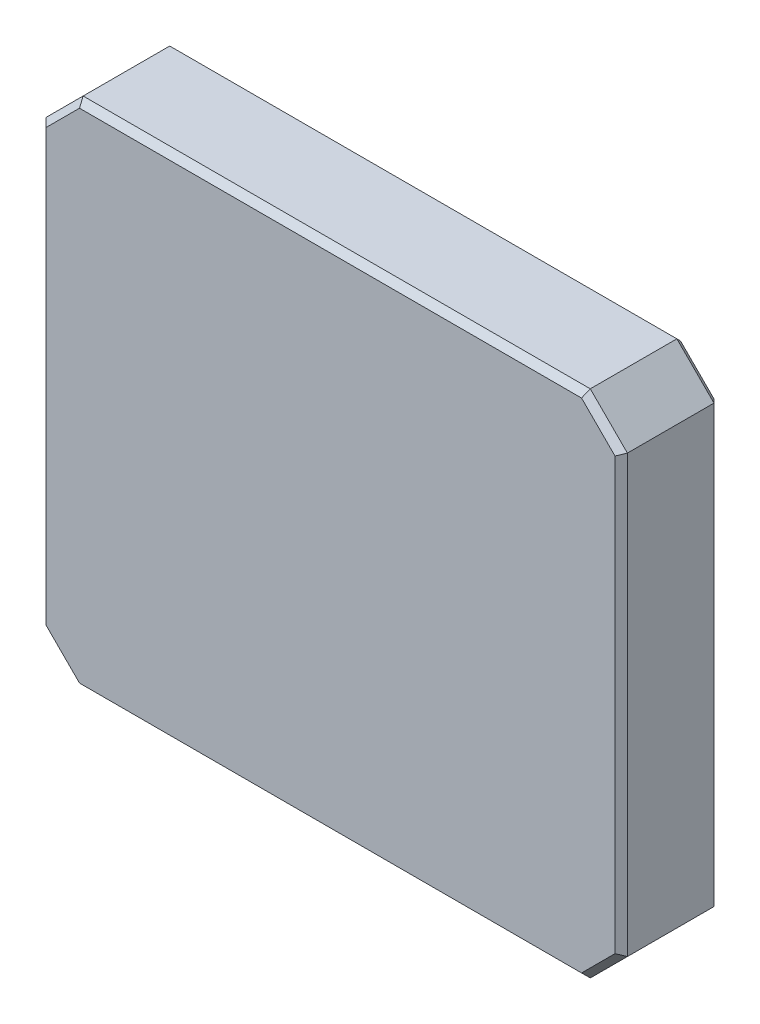
ISO-10303-21;
HEADER;
FILE_DESCRIPTION(('STEP AP214'),'2;1');
FILE_NAME('part.step','',(''),(''),'','','');
FILE_SCHEMA(('AUTOMOTIVE_DESIGN { 1 0 10303 214 1 1 1 1 }'));
ENDSEC;
DATA;
#1=APPLICATION_CONTEXT('core data for automotive mechanical design processes');
#2=APPLICATION_PROTOCOL_DEFINITION('international standard','automotive_design',2000,#1);
#3=PRODUCT_CONTEXT('',#1,'mechanical');
#4=PRODUCT('Part','Part','',(#3));
#5=PRODUCT_RELATED_PRODUCT_CATEGORY('part','',(#4));
#6=PRODUCT_DEFINITION_FORMATION('','',#4);
#7=PRODUCT_DEFINITION_CONTEXT('part definition',#1,'design');
#8=PRODUCT_DEFINITION('design','',#6,#7);
#9=PRODUCT_DEFINITION_SHAPE('','',#8);
#10=(LENGTH_UNIT() NAMED_UNIT(*) SI_UNIT(.MILLI.,.METRE.));
#11=(NAMED_UNIT(*) PLANE_ANGLE_UNIT() SI_UNIT($,.RADIAN.));
#12=(NAMED_UNIT(*) SI_UNIT($,.STERADIAN.) SOLID_ANGLE_UNIT());
#13=UNCERTAINTY_MEASURE_WITH_UNIT(LENGTH_MEASURE(1.E-05),#10,'distance_accuracy_value','');
#14=(GEOMETRIC_REPRESENTATION_CONTEXT(3) GLOBAL_UNCERTAINTY_ASSIGNED_CONTEXT((#13)) GLOBAL_UNIT_ASSIGNED_CONTEXT((#10,
#11,#12)) REPRESENTATION_CONTEXT('',''));
#15=CARTESIAN_POINT('',(0.,0.,0.));
#16=DIRECTION('',(0.,0.,1.));
#17=DIRECTION('',(1.,0.,0.));
#18=AXIS2_PLACEMENT_3D('',#15,#16,#17);
#19=CARTESIAN_POINT('',(-47.,-35.25,16.));
#20=DIRECTION('',(1.,0.,0.));
#21=DIRECTION('',(0.,0.,-1.));
#22=AXIS2_PLACEMENT_3D('',#19,#20,#21);
#23=PLANE('',#22);
#24=DIRECTION('',(0.,0.,-1.));
#25=VECTOR('',#24,1.);
#26=CARTESIAN_POINT('',(-47.,-35.25,16.));
#27=LINE('',#26,#25);
#28=CARTESIAN_POINT('',(-47.,-35.25,15.));
#29=VERTEX_POINT('',#28);
#30=CARTESIAN_POINT('',(-47.,-35.25,1.));
#31=VERTEX_POINT('',#30);
#32=EDGE_CURVE('E175',#29,#31,#27,.T.);
#33=ORIENTED_EDGE('',*,*,#32,.F.);
#34=DIRECTION('',(0.,1.,0.));
#35=VECTOR('',#34,1.);
#36=CARTESIAN_POINT('',(-47.,-35.25,15.));
#37=LINE('',#36,#35);
#38=CARTESIAN_POINT('',(-47.,35.25,15.));
#39=VERTEX_POINT('',#38);
#40=EDGE_CURVE('E216',#29,#39,#37,.T.);
#41=ORIENTED_EDGE('',*,*,#40,.T.);
#42=DIRECTION('',(0.,0.,-1.));
#43=VECTOR('',#42,1.);
#44=CARTESIAN_POINT('',(-47.,35.25,16.));
#45=LINE('',#44,#43);
#46=CARTESIAN_POINT('',(-47.,35.25,1.));
#47=VERTEX_POINT('',#46);
#48=EDGE_CURVE('E248',#39,#47,#45,.T.);
#49=ORIENTED_EDGE('',*,*,#48,.T.);
#50=DIRECTION('',(0.,-1.,0.));
#51=VECTOR('',#50,1.);
#52=CARTESIAN_POINT('',(-47.,-35.25,1.));
#53=LINE('',#52,#51);
#54=EDGE_CURVE('E214',#47,#31,#53,.T.);
#55=ORIENTED_EDGE('',*,*,#54,.T.);
#56=EDGE_LOOP('',(#33,#41,#49,#55));
#57=FACE_BOUND('',#56,.T.);
#58=ADVANCED_FACE('F39',(#57),#23,.F.);
#59=CARTESIAN_POINT('',(-47.,-35.25,16.));
#60=DIRECTION('',(0.707106781186547,0.707106781186547,0.));
#61=DIRECTION('',(-0.707106781186548,0.707106781186548,0.));
#62=AXIS2_PLACEMENT_3D('',#59,#60,#61);
#63=PLANE('',#62);
#64=DIRECTION('',(0.,0.,-1.));
#65=VECTOR('',#64,1.);
#66=CARTESIAN_POINT('',(-41.,-41.25,16.));
#67=LINE('',#66,#65);
#68=CARTESIAN_POINT('',(-41.,-41.25,15.));
#69=VERTEX_POINT('',#68);
#70=CARTESIAN_POINT('',(-41.,-41.25,1.));
#71=VERTEX_POINT('',#70);
#72=EDGE_CURVE('E313',#69,#71,#67,.T.);
#73=ORIENTED_EDGE('',*,*,#72,.F.);
#74=DIRECTION('',(-0.707106781186548,0.707106781186548,0.));
#75=VECTOR('',#74,1.);
#76=CARTESIAN_POINT('',(-47.,-35.25,15.));
#77=LINE('',#76,#75);
#78=EDGE_CURVE('E212',#69,#29,#77,.T.);
#79=ORIENTED_EDGE('',*,*,#78,.T.);
#80=ORIENTED_EDGE('',*,*,#32,.T.);
#81=DIRECTION('',(0.707106781186548,-0.707106781186548,0.));
#82=VECTOR('',#81,1.);
#83=CARTESIAN_POINT('',(-41.,-41.25,1.));
#84=LINE('',#83,#82);
#85=EDGE_CURVE('E210',#31,#71,#84,.T.);
#86=ORIENTED_EDGE('',*,*,#85,.T.);
#87=EDGE_LOOP('',(#73,#79,#80,#86));
#88=FACE_BOUND('',#87,.T.);
#89=ADVANCED_FACE('F371',(#88),#63,.F.);
#90=CARTESIAN_POINT('',(-41.,-41.25,16.));
#91=DIRECTION('',(0.,1.,0.));
#92=DIRECTION('',(0.,0.,1.));
#93=AXIS2_PLACEMENT_3D('',#90,#91,#92);
#94=PLANE('',#93);
#95=DIRECTION('',(0.,0.,-1.));
#96=VECTOR('',#95,1.);
#97=CARTESIAN_POINT('',(41.,-41.25,16.));
#98=LINE('',#97,#96);
#99=CARTESIAN_POINT('',(41.,-41.25,15.));
#100=VERTEX_POINT('',#99);
#101=CARTESIAN_POINT('',(41.,-41.25,1.));
#102=VERTEX_POINT('',#101);
#103=EDGE_CURVE('E310',#100,#102,#98,.T.);
#104=ORIENTED_EDGE('',*,*,#103,.F.);
#105=DIRECTION('',(-1.,0.,0.));
#106=VECTOR('',#105,1.);
#107=CARTESIAN_POINT('',(-41.,-41.25,15.));
#108=LINE('',#107,#106);
#109=EDGE_CURVE('E208',#100,#69,#108,.T.);
#110=ORIENTED_EDGE('',*,*,#109,.T.);
#111=ORIENTED_EDGE('',*,*,#72,.T.);
#112=DIRECTION('',(1.,0.,0.));
#113=VECTOR('',#112,1.);
#114=CARTESIAN_POINT('',(41.,-41.25,1.));
#115=LINE('',#114,#113);
#116=EDGE_CURVE('E206',#71,#102,#115,.T.);
#117=ORIENTED_EDGE('',*,*,#116,.T.);
#118=EDGE_LOOP('',(#104,#110,#111,#117));
#119=FACE_BOUND('',#118,.T.);
#120=ADVANCED_FACE('F354',(#119),#94,.F.);
#121=CARTESIAN_POINT('',(41.,-41.25,16.));
#122=DIRECTION('',(-0.707106781186547,0.707106781186547,0.));
#123=DIRECTION('',(-0.707106781186548,-0.707106781186548,0.));
#124=AXIS2_PLACEMENT_3D('',#121,#122,#123);
#125=PLANE('',#124);
#126=DIRECTION('',(0.,0.,-1.));
#127=VECTOR('',#126,1.);
#128=CARTESIAN_POINT('',(47.,-35.25,16.));
#129=LINE('',#128,#127);
#130=CARTESIAN_POINT('',(47.,-35.25,15.));
#131=VERTEX_POINT('',#130);
#132=CARTESIAN_POINT('',(47.,-35.25,1.));
#133=VERTEX_POINT('',#132);
#134=EDGE_CURVE('E307',#131,#133,#129,.T.);
#135=ORIENTED_EDGE('',*,*,#134,.F.);
#136=DIRECTION('',(-0.707106781186548,-0.707106781186548,0.));
#137=VECTOR('',#136,1.);
#138=CARTESIAN_POINT('',(41.,-41.25,15.));
#139=LINE('',#138,#137);
#140=EDGE_CURVE('E204',#131,#100,#139,.T.);
#141=ORIENTED_EDGE('',*,*,#140,.T.);
#142=ORIENTED_EDGE('',*,*,#103,.T.);
#143=DIRECTION('',(0.707106781186548,0.707106781186548,0.));
#144=VECTOR('',#143,1.);
#145=CARTESIAN_POINT('',(47.,-35.25,1.));
#146=LINE('',#145,#144);
#147=EDGE_CURVE('E202',#102,#133,#146,.T.);
#148=ORIENTED_EDGE('',*,*,#147,.T.);
#149=EDGE_LOOP('',(#135,#141,#142,#148));
#150=FACE_BOUND('',#149,.T.);
#151=ADVANCED_FACE('F352',(#150),#125,.F.);
#152=CARTESIAN_POINT('',(47.,-35.25,16.));
#153=DIRECTION('',(-1.,0.,0.));
#154=DIRECTION('',(0.,-1.,0.));
#155=AXIS2_PLACEMENT_3D('',#152,#153,#154);
#156=PLANE('',#155);
#157=DIRECTION('',(0.,0.,-1.));
#158=VECTOR('',#157,1.);
#159=CARTESIAN_POINT('',(47.,35.25,16.));
#160=LINE('',#159,#158);
#161=CARTESIAN_POINT('',(47.,35.25,15.));
#162=VERTEX_POINT('',#161);
#163=CARTESIAN_POINT('',(47.,35.25,1.));
#164=VERTEX_POINT('',#163);
#165=EDGE_CURVE('E301',#162,#164,#160,.T.);
#166=ORIENTED_EDGE('',*,*,#165,.F.);
#167=DIRECTION('',(0.,-1.,0.));
#168=VECTOR('',#167,1.);
#169=CARTESIAN_POINT('',(47.,-35.25,15.));
#170=LINE('',#169,#168);
#171=EDGE_CURVE('E200',#162,#131,#170,.T.);
#172=ORIENTED_EDGE('',*,*,#171,.T.);
#173=ORIENTED_EDGE('',*,*,#134,.T.);
#174=DIRECTION('',(0.,1.,0.));
#175=VECTOR('',#174,1.);
#176=CARTESIAN_POINT('',(47.,35.25,1.));
#177=LINE('',#176,#175);
#178=EDGE_CURVE('E198',#133,#164,#177,.T.);
#179=ORIENTED_EDGE('',*,*,#178,.T.);
#180=EDGE_LOOP('',(#166,#172,#173,#179));
#181=FACE_BOUND('',#180,.T.);
#182=ADVANCED_FACE('F339',(#181),#156,.F.);
#183=CARTESIAN_POINT('',(41.,41.25,16.));
#184=DIRECTION('',(-0.707106781186547,-0.707106781186547,0.));
#185=DIRECTION('',(0.707106781186548,-0.707106781186548,0.));
#186=AXIS2_PLACEMENT_3D('',#183,#184,#185);
#187=PLANE('',#186);
#188=DIRECTION('',(0.,0.,-1.));
#189=VECTOR('',#188,1.);
#190=CARTESIAN_POINT('',(41.,41.25,16.));
#191=LINE('',#190,#189);
#192=CARTESIAN_POINT('',(41.,41.25,15.));
#193=VERTEX_POINT('',#192);
#194=CARTESIAN_POINT('',(41.,41.25,1.));
#195=VERTEX_POINT('',#194);
#196=EDGE_CURVE('E295',#193,#195,#191,.T.);
#197=ORIENTED_EDGE('',*,*,#196,.F.);
#198=DIRECTION('',(0.707106781186548,-0.707106781186548,0.));
#199=VECTOR('',#198,1.);
#200=CARTESIAN_POINT('',(41.,41.25,15.));
#201=LINE('',#200,#199);
#202=EDGE_CURVE('E196',#193,#162,#201,.T.);
#203=ORIENTED_EDGE('',*,*,#202,.T.);
#204=ORIENTED_EDGE('',*,*,#165,.T.);
#205=DIRECTION('',(-0.707106781186548,0.707106781186548,0.));
#206=VECTOR('',#205,1.);
#207=CARTESIAN_POINT('',(41.,41.25,1.));
#208=LINE('',#207,#206);
#209=EDGE_CURVE('E194',#164,#195,#208,.T.);
#210=ORIENTED_EDGE('',*,*,#209,.T.);
#211=EDGE_LOOP('',(#197,#203,#204,#210));
#212=FACE_BOUND('',#211,.T.);
#213=ADVANCED_FACE('F335',(#212),#187,.F.);
#214=CARTESIAN_POINT('',(-41.,41.25,16.));
#215=DIRECTION('',(0.,-1.,0.));
#216=DIRECTION('',(0.,0.,-1.));
#217=AXIS2_PLACEMENT_3D('',#214,#215,#216);
#218=PLANE('',#217);
#219=DIRECTION('',(0.,0.,-1.));
#220=VECTOR('',#219,1.);
#221=CARTESIAN_POINT('',(-41.,41.25,16.));
#222=LINE('',#221,#220);
#223=CARTESIAN_POINT('',(-41.,41.25,15.));
#224=VERTEX_POINT('',#223);
#225=CARTESIAN_POINT('',(-41.,41.25,1.));
#226=VERTEX_POINT('',#225);
#227=EDGE_CURVE('E293',#224,#226,#222,.T.);
#228=ORIENTED_EDGE('',*,*,#227,.F.);
#229=DIRECTION('',(1.,0.,0.));
#230=VECTOR('',#229,1.);
#231=CARTESIAN_POINT('',(-41.,41.25,15.));
#232=LINE('',#231,#230);
#233=EDGE_CURVE('E192',#224,#193,#232,.T.);
#234=ORIENTED_EDGE('',*,*,#233,.T.);
#235=ORIENTED_EDGE('',*,*,#196,.T.);
#236=DIRECTION('',(-1.,0.,0.));
#237=VECTOR('',#236,1.);
#238=CARTESIAN_POINT('',(-41.,41.25,1.));
#239=LINE('',#238,#237);
#240=EDGE_CURVE('E190',#195,#226,#239,.T.);
#241=ORIENTED_EDGE('',*,*,#240,.T.);
#242=EDGE_LOOP('',(#228,#234,#235,#241));
#243=FACE_BOUND('',#242,.T.);
#244=ADVANCED_FACE('F292',(#243),#218,.F.);
#245=CARTESIAN_POINT('',(-47.,35.25,16.));
#246=DIRECTION('',(0.707106781186547,-0.707106781186547,0.));
#247=DIRECTION('',(0.707106781186548,0.707106781186548,0.));
#248=AXIS2_PLACEMENT_3D('',#245,#246,#247);
#249=PLANE('',#248);
#250=ORIENTED_EDGE('',*,*,#48,.F.);
#251=DIRECTION('',(0.707106781186548,0.707106781186548,0.));
#252=VECTOR('',#251,1.);
#253=CARTESIAN_POINT('',(-47.,35.25,15.));
#254=LINE('',#253,#252);
#255=EDGE_CURVE('E162',#39,#224,#254,.T.);
#256=ORIENTED_EDGE('',*,*,#255,.T.);
#257=ORIENTED_EDGE('',*,*,#227,.T.);
#258=DIRECTION('',(-0.707106781186548,-0.707106781186548,0.));
#259=VECTOR('',#258,1.);
#260=CARTESIAN_POINT('',(-47.,35.25,1.));
#261=LINE('',#260,#259);
#262=EDGE_CURVE('E181',#226,#47,#261,.T.);
#263=ORIENTED_EDGE('',*,*,#262,.T.);
#264=EDGE_LOOP('',(#250,#256,#257,#263));
#265=FACE_BOUND('',#264,.T.);
#266=ADVANCED_FACE('F298',(#265),#249,.F.);
#267=CARTESIAN_POINT('',(0.,0.,16.));
#268=DIRECTION('',(0.,0.,-1.));
#269=DIRECTION('',(-1.,0.,0.));
#270=AXIS2_PLACEMENT_3D('',#267,#268,#269);
#271=PLANE('',#270);
#272=DIRECTION('',(-1.,0.,0.));
#273=VECTOR('',#272,1.);
#274=CARTESIAN_POINT('',(0.,40.25,16.));
#275=LINE('',#274,#273);
#276=CARTESIAN_POINT('',(40.5857864376269,40.25,16.));
#277=VERTEX_POINT('',#276);
#278=CARTESIAN_POINT('',(-40.5857864376269,40.25,16.));
#279=VERTEX_POINT('',#278);
#280=EDGE_CURVE('E179',#277,#279,#275,.T.);
#281=ORIENTED_EDGE('',*,*,#280,.T.);
#282=DIRECTION('',(-0.707106781186548,-0.707106781186548,0.));
#283=VECTOR('',#282,1.);
#284=CARTESIAN_POINT('',(-40.4178932188134,40.4178932188134,16.));
#285=LINE('',#284,#283);
#286=CARTESIAN_POINT('',(-46.,34.8357864376269,16.));
#287=VERTEX_POINT('',#286);
#288=EDGE_CURVE('E160',#279,#287,#285,.T.);
#289=ORIENTED_EDGE('',*,*,#288,.T.);
#290=DIRECTION('',(0.,-1.,0.));
#291=VECTOR('',#290,1.);
#292=CARTESIAN_POINT('',(-46.,0.,16.));
#293=LINE('',#292,#291);
#294=CARTESIAN_POINT('',(-46.,-34.8357864376269,16.));
#295=VERTEX_POINT('',#294);
#296=EDGE_CURVE('E168',#287,#295,#293,.T.);
#297=ORIENTED_EDGE('',*,*,#296,.T.);
#298=DIRECTION('',(0.707106781186548,-0.707106781186548,0.));
#299=VECTOR('',#298,1.);
#300=CARTESIAN_POINT('',(-40.4178932188134,-40.4178932188134,16.));
#301=LINE('',#300,#299);
#302=CARTESIAN_POINT('',(-40.5857864376269,-40.25,16.));
#303=VERTEX_POINT('',#302);
#304=EDGE_CURVE('E174',#295,#303,#301,.T.);
#305=ORIENTED_EDGE('',*,*,#304,.T.);
#306=DIRECTION('',(1.,0.,0.));
#307=VECTOR('',#306,1.);
#308=CARTESIAN_POINT('',(0.,-40.25,16.));
#309=LINE('',#308,#307);
#310=CARTESIAN_POINT('',(40.5857864376269,-40.25,16.));
#311=VERTEX_POINT('',#310);
#312=EDGE_CURVE('E319',#303,#311,#309,.T.);
#313=ORIENTED_EDGE('',*,*,#312,.T.);
#314=DIRECTION('',(0.707106781186548,0.707106781186548,0.));
#315=VECTOR('',#314,1.);
#316=CARTESIAN_POINT('',(40.4178932188134,-40.4178932188134,16.));
#317=LINE('',#316,#315);
#318=CARTESIAN_POINT('',(46.,-34.8357864376269,16.));
#319=VERTEX_POINT('',#318);
#320=EDGE_CURVE('E321',#311,#319,#317,.T.);
#321=ORIENTED_EDGE('',*,*,#320,.T.);
#322=DIRECTION('',(0.,1.,0.));
#323=VECTOR('',#322,1.);
#324=CARTESIAN_POINT('',(46.,0.,16.));
#325=LINE('',#324,#323);
#326=CARTESIAN_POINT('',(46.,34.8357864376269,16.));
#327=VERTEX_POINT('',#326);
#328=EDGE_CURVE('E323',#319,#327,#325,.T.);
#329=ORIENTED_EDGE('',*,*,#328,.T.);
#330=DIRECTION('',(-0.707106781186548,0.707106781186548,0.));
#331=VECTOR('',#330,1.);
#332=CARTESIAN_POINT('',(40.4178932188134,40.4178932188134,16.));
#333=LINE('',#332,#331);
#334=EDGE_CURVE('E185',#327,#277,#333,.T.);
#335=ORIENTED_EDGE('',*,*,#334,.T.);
#336=EDGE_LOOP('',(#281,#289,#297,#305,#313,#321,#329,#335));
#337=FACE_BOUND('',#336,.T.);
#338=ADVANCED_FACE('F177',(#337),#271,.F.);
#339=CARTESIAN_POINT('',(0.,0.,0.));
#340=DIRECTION('',(0.,0.,-1.));
#341=DIRECTION('',(-1.,0.,0.));
#342=AXIS2_PLACEMENT_3D('',#339,#340,#341);
#343=PLANE('',#342);
#344=DIRECTION('',(0.,1.,0.));
#345=VECTOR('',#344,1.);
#346=CARTESIAN_POINT('',(-46.,35.25,0.));
#347=LINE('',#346,#345);
#348=CARTESIAN_POINT('',(-46.,-34.8357864376269,0.));
#349=VERTEX_POINT('',#348);
#350=CARTESIAN_POINT('',(-46.,34.8357864376269,0.));
#351=VERTEX_POINT('',#350);
#352=EDGE_CURVE('E218',#349,#351,#347,.T.);
#353=ORIENTED_EDGE('',*,*,#352,.T.);
#354=DIRECTION('',(0.707106781186548,0.707106781186548,0.));
#355=VECTOR('',#354,1.);
#356=CARTESIAN_POINT('',(-40.2928932188135,40.5428932188135,0.));
#357=LINE('',#356,#355);
#358=CARTESIAN_POINT('',(-40.5857864376269,40.25,0.));
#359=VERTEX_POINT('',#358);
#360=EDGE_CURVE('E11',#351,#359,#357,.T.);
#361=ORIENTED_EDGE('',*,*,#360,.T.);
#362=DIRECTION('',(1.,0.,0.));
#363=VECTOR('',#362,1.);
#364=CARTESIAN_POINT('',(41.,40.25,0.));
#365=LINE('',#364,#363);
#366=CARTESIAN_POINT('',(40.5857864376269,40.25,0.));
#367=VERTEX_POINT('',#366);
#368=EDGE_CURVE('E49',#359,#367,#365,.T.);
#369=ORIENTED_EDGE('',*,*,#368,.T.);
#370=DIRECTION('',(0.707106781186548,-0.707106781186548,0.));
#371=VECTOR('',#370,1.);
#372=CARTESIAN_POINT('',(46.2928932188134,34.5428932188135,0.));
#373=LINE('',#372,#371);
#374=CARTESIAN_POINT('',(46.,34.8357864376269,0.));
#375=VERTEX_POINT('',#374);
#376=EDGE_CURVE('E228',#367,#375,#373,.T.);
#377=ORIENTED_EDGE('',*,*,#376,.T.);
#378=DIRECTION('',(0.,-1.,0.));
#379=VECTOR('',#378,1.);
#380=CARTESIAN_POINT('',(46.,-35.25,0.));
#381=LINE('',#380,#379);
#382=CARTESIAN_POINT('',(46.,-34.8357864376269,0.));
#383=VERTEX_POINT('',#382);
#384=EDGE_CURVE('E226',#375,#383,#381,.T.);
#385=ORIENTED_EDGE('',*,*,#384,.T.);
#386=DIRECTION('',(-0.707106781186548,-0.707106781186548,0.));
#387=VECTOR('',#386,1.);
#388=CARTESIAN_POINT('',(40.2928932188134,-40.5428932188134,0.));
#389=LINE('',#388,#387);
#390=CARTESIAN_POINT('',(40.5857864376269,-40.25,0.));
#391=VERTEX_POINT('',#390);
#392=EDGE_CURVE('E224',#383,#391,#389,.T.);
#393=ORIENTED_EDGE('',*,*,#392,.T.);
#394=DIRECTION('',(-1.,0.,0.));
#395=VECTOR('',#394,1.);
#396=CARTESIAN_POINT('',(-41.,-40.25,0.));
#397=LINE('',#396,#395);
#398=CARTESIAN_POINT('',(-40.5857864376269,-40.25,0.));
#399=VERTEX_POINT('',#398);
#400=EDGE_CURVE('E222',#391,#399,#397,.T.);
#401=ORIENTED_EDGE('',*,*,#400,.T.);
#402=DIRECTION('',(-0.707106781186548,0.707106781186548,0.));
#403=VECTOR('',#402,1.);
#404=CARTESIAN_POINT('',(-46.2928932188135,-34.5428932188135,0.));
#405=LINE('',#404,#403);
#406=EDGE_CURVE('E220',#399,#349,#405,.T.);
#407=ORIENTED_EDGE('',*,*,#406,.T.);
#408=EDGE_LOOP('',(#353,#361,#369,#377,#385,#393,#401,#407));
#409=FACE_BOUND('',#408,.T.);
#410=ADVANCED_FACE('F279',(#409),#343,.T.);
#411=CARTESIAN_POINT('',(40.4178932188134,-40.4178932188134,16.));
#412=DIRECTION('',(-0.5,0.5,-0.707106781186548));
#413=DIRECTION('',(0.707106781186548,0.707106781186548,0.));
#414=AXIS2_PLACEMENT_3D('',#411,#412,#413);
#415=PLANE('',#414);
#416=DIRECTION('',(-0.281084637714821,0.678598344545847,0.678598344545847));
#417=VECTOR('',#416,1.);
#418=CARTESIAN_POINT('',(37.3791613444087,-32.5085222105068,23.7414777894931));
#419=LINE('',#418,#417);
#420=EDGE_CURVE('E242',#100,#311,#419,.T.);
#421=ORIENTED_EDGE('',*,*,#420,.F.);
#422=ORIENTED_EDGE('',*,*,#140,.F.);
#423=DIRECTION('',(-0.678598344545848,0.281084637714819,0.678598344545846));
#424=VECTOR('',#423,1.);
#425=CARTESIAN_POINT('',(44.4942147311441,-34.2120697572452,17.5057852688559));
#426=LINE('',#425,#424);
#427=EDGE_CURVE('E245',#319,#131,#426,.F.);
#428=ORIENTED_EDGE('',*,*,#427,.F.);
#429=ORIENTED_EDGE('',*,*,#320,.F.);
#430=EDGE_LOOP('',(#421,#422,#428,#429));
#431=FACE_BOUND('',#430,.T.);
#432=ADVANCED_FACE('F348',(#431),#415,.F.);
#433=CARTESIAN_POINT('',(46.,0.,16.));
#434=DIRECTION('',(-0.707106781186546,0.,-0.707106781186549));
#435=DIRECTION('',(0.,1.,0.));
#436=AXIS2_PLACEMENT_3D('',#433,#434,#435);
#437=PLANE('',#436);
#438=ORIENTED_EDGE('',*,*,#427,.T.);
#439=ORIENTED_EDGE('',*,*,#171,.F.);
#440=DIRECTION('',(-0.678598344545849,-0.281084637714815,0.678598344545847));
#441=VECTOR('',#440,1.);
#442=CARTESIAN_POINT('',(39.3552977370326,32.0834606423747,22.6447022629673));
#443=LINE('',#442,#441);
#444=EDGE_CURVE('E239',#327,#162,#443,.F.);
#445=ORIENTED_EDGE('',*,*,#444,.F.);
#446=ORIENTED_EDGE('',*,*,#328,.F.);
#447=EDGE_LOOP('',(#438,#439,#445,#446));
#448=FACE_BOUND('',#447,.T.);
#449=ADVANCED_FACE('F342',(#448),#437,.F.);
#450=CARTESIAN_POINT('',(0.,-40.25,16.));
#451=DIRECTION('',(0.,0.707106781186547,-0.707106781186547));
#452=DIRECTION('',(1.,0.,0.));
#453=AXIS2_PLACEMENT_3D('',#450,#451,#452);
#454=PLANE('',#453);
#455=ORIENTED_EDGE('',*,*,#420,.T.);
#456=ORIENTED_EDGE('',*,*,#312,.F.);
#457=DIRECTION('',(0.281084637714821,0.678598344545847,0.678598344545847));
#458=VECTOR('',#457,1.);
#459=CARTESIAN_POINT('',(-40.604545985805,-40.2952895556355,15.9547104443645));
#460=LINE('',#459,#458);
#461=EDGE_CURVE('E236',#69,#303,#460,.T.);
#462=ORIENTED_EDGE('',*,*,#461,.F.);
#463=ORIENTED_EDGE('',*,*,#109,.F.);
#464=EDGE_LOOP('',(#455,#456,#462,#463));
#465=FACE_BOUND('',#464,.T.);
#466=ADVANCED_FACE('F378',(#465),#454,.F.);
#467=CARTESIAN_POINT('',(40.4178932188134,40.4178932188134,16.));
#468=DIRECTION('',(-0.500000000000001,-0.500000000000001,-0.707106781186546));
#469=DIRECTION('',(-0.707106781186548,0.707106781186548,0.));
#470=AXIS2_PLACEMENT_3D('',#467,#468,#469);
#471=PLANE('',#470);
#472=ORIENTED_EDGE('',*,*,#444,.T.);
#473=ORIENTED_EDGE('',*,*,#202,.F.);
#474=DIRECTION('',(-0.281084637714817,-0.678598344545848,0.678598344545848));
#475=VECTOR('',#474,1.);
#476=CARTESIAN_POINT('',(40.604545985805,40.2952895556355,15.9547104443645));
#477=LINE('',#476,#475);
#478=EDGE_CURVE('E233',#277,#193,#477,.F.);
#479=ORIENTED_EDGE('',*,*,#478,.F.);
#480=ORIENTED_EDGE('',*,*,#334,.F.);
#481=EDGE_LOOP('',(#472,#473,#479,#480));
#482=FACE_BOUND('',#481,.T.);
#483=ADVANCED_FACE('F330',(#482),#471,.F.);
#484=CARTESIAN_POINT('',(-40.4178932188134,-40.4178932188134,16.));
#485=DIRECTION('',(0.5,0.5,-0.707106781186548));
#486=DIRECTION('',(0.707106781186548,-0.707106781186548,0.));
#487=AXIS2_PLACEMENT_3D('',#484,#485,#486);
#488=PLANE('',#487);
#489=ORIENTED_EDGE('',*,*,#461,.T.);
#490=ORIENTED_EDGE('',*,*,#304,.F.);
#491=DIRECTION('',(0.678598344545847,0.281084637714821,0.678598344545847));
#492=VECTOR('',#491,1.);
#493=CARTESIAN_POINT('',(-39.3552977370325,-32.0834606423746,22.6447022629675));
#494=LINE('',#493,#492);
#495=EDGE_CURVE('E171',#29,#295,#494,.T.);
#496=ORIENTED_EDGE('',*,*,#495,.F.);
#497=ORIENTED_EDGE('',*,*,#78,.F.);
#498=EDGE_LOOP('',(#489,#490,#496,#497));
#499=FACE_BOUND('',#498,.T.);
#500=ADVANCED_FACE('F375',(#499),#488,.F.);
#501=CARTESIAN_POINT('',(0.,40.25,16.));
#502=DIRECTION('',(0.,-0.707106781186547,-0.707106781186547));
#503=DIRECTION('',(-1.,0.,0.));
#504=AXIS2_PLACEMENT_3D('',#501,#502,#503);
#505=PLANE('',#504);
#506=ORIENTED_EDGE('',*,*,#478,.T.);
#507=ORIENTED_EDGE('',*,*,#233,.F.);
#508=DIRECTION('',(0.281084637714822,-0.678598344545847,0.678598344545847));
#509=VECTOR('',#508,1.);
#510=CARTESIAN_POINT('',(-37.3791613444087,32.5085222105068,23.7414777894932));
#511=LINE('',#510,#509);
#512=EDGE_CURVE('E165',#279,#224,#511,.F.);
#513=ORIENTED_EDGE('',*,*,#512,.F.);
#514=ORIENTED_EDGE('',*,*,#280,.F.);
#515=EDGE_LOOP('',(#506,#507,#513,#514));
#516=FACE_BOUND('',#515,.T.);
#517=ADVANCED_FACE('F333',(#516),#505,.F.);
#518=CARTESIAN_POINT('',(-46.,0.,16.));
#519=DIRECTION('',(0.707106781186547,0.,-0.707106781186547));
#520=DIRECTION('',(0.,-1.,0.));
#521=AXIS2_PLACEMENT_3D('',#518,#519,#520);
#522=PLANE('',#521);
#523=ORIENTED_EDGE('',*,*,#495,.T.);
#524=ORIENTED_EDGE('',*,*,#296,.F.);
#525=DIRECTION('',(-0.678598344545847,0.281084637714822,-0.678598344545847));
#526=VECTOR('',#525,1.);
#527=CARTESIAN_POINT('',(-39.3552977370325,32.0834606423746,22.6447022629675));
#528=LINE('',#527,#526);
#529=EDGE_CURVE('E156',#39,#287,#528,.F.);
#530=ORIENTED_EDGE('',*,*,#529,.F.);
#531=ORIENTED_EDGE('',*,*,#40,.F.);
#532=EDGE_LOOP('',(#523,#524,#530,#531));
#533=FACE_BOUND('',#532,.T.);
#534=ADVANCED_FACE('F169',(#533),#522,.F.);
#535=CARTESIAN_POINT('',(-40.4178932188134,40.4178932188134,16.));
#536=DIRECTION('',(0.5,-0.5,-0.707106781186548));
#537=DIRECTION('',(-0.707106781186548,-0.707106781186548,0.));
#538=AXIS2_PLACEMENT_3D('',#535,#536,#537);
#539=PLANE('',#538);
#540=ORIENTED_EDGE('',*,*,#512,.T.);
#541=ORIENTED_EDGE('',*,*,#255,.F.);
#542=ORIENTED_EDGE('',*,*,#529,.T.);
#543=ORIENTED_EDGE('',*,*,#288,.F.);
#544=EDGE_LOOP('',(#540,#541,#542,#543));
#545=FACE_BOUND('',#544,.T.);
#546=ADVANCED_FACE('F158',(#545),#539,.F.);
#547=CARTESIAN_POINT('',(41.,-41.25,1.));
#548=DIRECTION('',(0.500000000000001,-0.500000000000001,-0.707106781186546));
#549=DIRECTION('',(-0.707106781186548,-0.707106781186548,0.));
#550=AXIS2_PLACEMENT_3D('',#547,#548,#549);
#551=PLANE('',#550);
#552=DIRECTION('',(0.281084637714816,-0.678598344545848,0.678598344545848));
#553=VECTOR('',#552,1.);
#554=CARTESIAN_POINT('',(34.5212969681399,-25.6090272738954,-14.6409727261046));
#555=LINE('',#554,#553);
#556=EDGE_CURVE('E263',#391,#102,#555,.T.);
#557=ORIENTED_EDGE('',*,*,#556,.F.);
#558=ORIENTED_EDGE('',*,*,#392,.F.);
#559=DIRECTION('',(0.678598344545849,-0.281084637714814,0.678598344545847));
#560=VECTOR('',#559,1.);
#561=CARTESIAN_POINT('',(45.381487139661,-34.5795900223724,-0.618512860338943));
#562=LINE('',#561,#560);
#563=EDGE_CURVE('E44',#133,#383,#562,.F.);
#564=ORIENTED_EDGE('',*,*,#563,.F.);
#565=ORIENTED_EDGE('',*,*,#147,.F.);
#566=EDGE_LOOP('',(#557,#558,#564,#565));
#567=FACE_BOUND('',#566,.T.);
#568=ADVANCED_FACE('F42',(#567),#551,.T.);
#569=CARTESIAN_POINT('',(47.,-35.25,1.));
#570=DIRECTION('',(0.707106781186546,0.,-0.707106781186549));
#571=DIRECTION('',(0.,-1.,0.));
#572=AXIS2_PLACEMENT_3D('',#569,#570,#571);
#573=PLANE('',#572);
#574=ORIENTED_EDGE('',*,*,#563,.T.);
#575=ORIENTED_EDGE('',*,*,#384,.F.);
#576=DIRECTION('',(0.678598344545849,0.281084637714818,0.678598344545846));
#577=VECTOR('',#576,1.);
#578=CARTESIAN_POINT('',(33.5525783269466,29.6798955640714,-12.4474216730534));
#579=LINE('',#578,#577);
#580=EDGE_CURVE('E261',#164,#375,#579,.F.);
#581=ORIENTED_EDGE('',*,*,#580,.F.);
#582=ORIENTED_EDGE('',*,*,#178,.F.);
#583=EDGE_LOOP('',(#574,#575,#581,#582));
#584=FACE_BOUND('',#583,.T.);
#585=ADVANCED_FACE('F274',(#584),#573,.T.);
#586=CARTESIAN_POINT('',(-41.,-41.25,1.));
#587=DIRECTION('',(0.,-0.707106781186547,-0.707106781186547));
#588=DIRECTION('',(-1.,0.,0.));
#589=AXIS2_PLACEMENT_3D('',#586,#587,#588);
#590=PLANE('',#589);
#591=ORIENTED_EDGE('',*,*,#556,.T.);
#592=ORIENTED_EDGE('',*,*,#116,.F.);
#593=DIRECTION('',(-0.281084637714808,-0.67859834454585,0.67859834454585));
#594=VECTOR('',#593,1.);
#595=CARTESIAN_POINT('',(-40.3295900223724,-39.631487139661,-0.618512860338974));
#596=LINE('',#595,#594);
#597=EDGE_CURVE('E258',#399,#71,#596,.T.);
#598=ORIENTED_EDGE('',*,*,#597,.F.);
#599=ORIENTED_EDGE('',*,*,#400,.F.);
#600=EDGE_LOOP('',(#591,#592,#598,#599));
#601=FACE_BOUND('',#600,.T.);
#602=ADVANCED_FACE('F356',(#601),#590,.T.);
#603=CARTESIAN_POINT('',(41.,41.25,1.));
#604=DIRECTION('',(0.5,0.5,-0.707106781186548));
#605=DIRECTION('',(0.707106781186548,-0.707106781186548,0.));
#606=AXIS2_PLACEMENT_3D('',#603,#604,#605);
#607=PLANE('',#606);
#608=ORIENTED_EDGE('',*,*,#580,.T.);
#609=ORIENTED_EDGE('',*,*,#376,.F.);
#610=DIRECTION('',(0.281084637714821,0.678598344545847,0.678598344545847));
#611=VECTOR('',#610,1.);
#612=CARTESIAN_POINT('',(41.,41.25,1.));
#613=LINE('',#612,#611);
#614=EDGE_CURVE('E255',#195,#367,#613,.F.);
#615=ORIENTED_EDGE('',*,*,#614,.F.);
#616=ORIENTED_EDGE('',*,*,#209,.F.);
#617=EDGE_LOOP('',(#608,#609,#615,#616));
#618=FACE_BOUND('',#617,.T.);
#619=ADVANCED_FACE('F283',(#618),#607,.T.);
#620=CARTESIAN_POINT('',(-47.,-35.25,1.));
#621=DIRECTION('',(-0.500000000000004,-0.500000000000004,-0.707106781186542));
#622=DIRECTION('',(-0.707106781186548,0.707106781186548,0.));
#623=AXIS2_PLACEMENT_3D('',#620,#621,#622);
#624=PLANE('',#623);
#625=ORIENTED_EDGE('',*,*,#597,.T.);
#626=ORIENTED_EDGE('',*,*,#85,.F.);
#627=DIRECTION('',(-0.67859834454585,-0.281084637714808,0.67859834454585));
#628=VECTOR('',#627,1.);
#629=CARTESIAN_POINT('',(-47.,-35.25,1.));
#630=LINE('',#629,#628);
#631=EDGE_CURVE('E252',#349,#31,#630,.T.);
#632=ORIENTED_EDGE('',*,*,#631,.F.);
#633=ORIENTED_EDGE('',*,*,#406,.F.);
#634=EDGE_LOOP('',(#625,#626,#632,#633));
#635=FACE_BOUND('',#634,.T.);
#636=ADVANCED_FACE('F360',(#635),#624,.T.);
#637=CARTESIAN_POINT('',(-41.,41.25,1.));
#638=DIRECTION('',(0.,0.707106781186547,-0.707106781186547));
#639=DIRECTION('',(1.,0.,0.));
#640=AXIS2_PLACEMENT_3D('',#637,#638,#639);
#641=PLANE('',#640);
#642=ORIENTED_EDGE('',*,*,#614,.T.);
#643=ORIENTED_EDGE('',*,*,#368,.F.);
#644=DIRECTION('',(-0.281084637714816,0.678598344545848,0.678598344545848));
#645=VECTOR('',#644,1.);
#646=CARTESIAN_POINT('',(-41.,41.25,1.));
#647=LINE('',#646,#645);
#648=EDGE_CURVE('E57',#226,#359,#647,.F.);
#649=ORIENTED_EDGE('',*,*,#648,.F.);
#650=ORIENTED_EDGE('',*,*,#240,.F.);
#651=EDGE_LOOP('',(#642,#643,#649,#650));
#652=FACE_BOUND('',#651,.T.);
#653=ADVANCED_FACE('F287',(#652),#641,.T.);
#654=CARTESIAN_POINT('',(-47.,-35.25,1.));
#655=DIRECTION('',(-0.707106781186547,0.,-0.707106781186547));
#656=DIRECTION('',(0.,1.,0.));
#657=AXIS2_PLACEMENT_3D('',#654,#655,#656);
#658=PLANE('',#657);
#659=ORIENTED_EDGE('',*,*,#631,.T.);
#660=ORIENTED_EDGE('',*,*,#54,.F.);
#661=DIRECTION('',(0.678598344545848,-0.281084637714816,-0.678598344545848));
#662=VECTOR('',#661,1.);
#663=CARTESIAN_POINT('',(-33.5525783269467,29.6798955640715,-12.4474216730533));
#664=LINE('',#663,#662);
#665=EDGE_CURVE('E249',#351,#47,#664,.F.);
#666=ORIENTED_EDGE('',*,*,#665,.F.);
#667=ORIENTED_EDGE('',*,*,#352,.F.);
#668=EDGE_LOOP('',(#659,#660,#666,#667));
#669=FACE_BOUND('',#668,.T.);
#670=ADVANCED_FACE('F367',(#669),#658,.T.);
#671=CARTESIAN_POINT('',(-47.,35.25,1.));
#672=DIRECTION('',(-0.500000000000001,0.500000000000001,-0.707106781186546));
#673=DIRECTION('',(0.707106781186548,0.707106781186548,0.));
#674=AXIS2_PLACEMENT_3D('',#671,#672,#673);
#675=PLANE('',#674);
#676=ORIENTED_EDGE('',*,*,#648,.T.);
#677=ORIENTED_EDGE('',*,*,#360,.F.);
#678=ORIENTED_EDGE('',*,*,#665,.T.);
#679=ORIENTED_EDGE('',*,*,#262,.F.);
#680=EDGE_LOOP('',(#676,#677,#678,#679));
#681=FACE_BOUND('',#680,.T.);
#682=ADVANCED_FACE('F365',(#681),#675,.T.);
#683=CLOSED_SHELL('',(#58,#89,#120,#151,#182,#213,#244,#266,#338,#410,#432,#449,#466,#483,#500,
#517,#534,#546,#568,#585,#602,#619,#636,#653,#670,#682));
#684=MANIFOLD_SOLID_BREP('B2',#683);
#685=ADVANCED_BREP_SHAPE_REPRESENTATION('',(#18,#684),#14);
#686=SHAPE_DEFINITION_REPRESENTATION(#9,#685);
ENDSEC;
END-ISO-10303-21;
